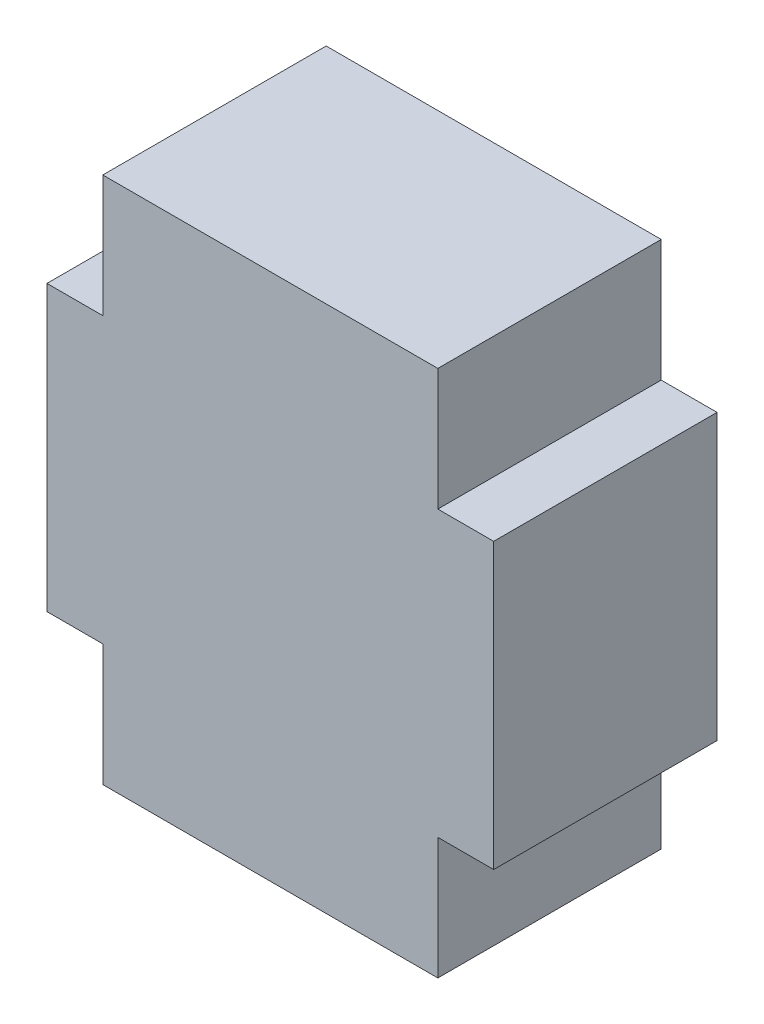
ISO-10303-21;
HEADER;
FILE_DESCRIPTION(('STEP AP214'),'2;1');
FILE_NAME('part.step','',(''),(''),'','','');
FILE_SCHEMA(('AUTOMOTIVE_DESIGN { 1 0 10303 214 1 1 1 1 }'));
ENDSEC;
DATA;
#1=APPLICATION_CONTEXT('core data for automotive mechanical design processes');
#2=APPLICATION_PROTOCOL_DEFINITION('international standard','automotive_design',2000,#1);
#3=PRODUCT_CONTEXT('',#1,'mechanical');
#4=PRODUCT('Part','Part','',(#3));
#5=PRODUCT_RELATED_PRODUCT_CATEGORY('part','',(#4));
#6=PRODUCT_DEFINITION_FORMATION('','',#4);
#7=PRODUCT_DEFINITION_CONTEXT('part definition',#1,'design');
#8=PRODUCT_DEFINITION('design','',#6,#7);
#9=PRODUCT_DEFINITION_SHAPE('','',#8);
#10=(LENGTH_UNIT() NAMED_UNIT(*) SI_UNIT(.MILLI.,.METRE.));
#11=(NAMED_UNIT(*) PLANE_ANGLE_UNIT() SI_UNIT($,.RADIAN.));
#12=(NAMED_UNIT(*) SI_UNIT($,.STERADIAN.) SOLID_ANGLE_UNIT());
#13=UNCERTAINTY_MEASURE_WITH_UNIT(LENGTH_MEASURE(1.E-05),#10,'distance_accuracy_value','');
#14=(GEOMETRIC_REPRESENTATION_CONTEXT(3) GLOBAL_UNCERTAINTY_ASSIGNED_CONTEXT((#13)) GLOBAL_UNIT_ASSIGNED_CONTEXT((#10,
#11,#12)) REPRESENTATION_CONTEXT('',''));
#15=CARTESIAN_POINT('',(0.,0.,0.));
#16=DIRECTION('',(0.,0.,1.));
#17=DIRECTION('',(1.,0.,0.));
#18=AXIS2_PLACEMENT_3D('',#15,#16,#17);
#19=CARTESIAN_POINT('',(0.825,-1.3,1.1));
#20=DIRECTION('',(0.,1.,0.));
#21=DIRECTION('',(0.,0.,1.));
#22=AXIS2_PLACEMENT_3D('',#19,#20,#21);
#23=PLANE('',#22);
#24=DIRECTION('',(1.,0.,0.));
#25=VECTOR('',#24,1.);
#26=CARTESIAN_POINT('',(0.825,-1.3,0.));
#27=LINE('',#26,#25);
#28=CARTESIAN_POINT('',(-0.825,-1.3,0.));
#29=VERTEX_POINT('',#28);
#30=CARTESIAN_POINT('',(0.825,-1.3,0.));
#31=VERTEX_POINT('',#30);
#32=EDGE_CURVE('E154',#29,#31,#27,.T.);
#33=ORIENTED_EDGE('',*,*,#32,.T.);
#34=DIRECTION('',(0.,0.,-1.));
#35=VECTOR('',#34,1.);
#36=CARTESIAN_POINT('',(0.825,-1.3,1.1));
#37=LINE('',#36,#35);
#38=CARTESIAN_POINT('',(0.825,-1.3,1.1));
#39=VERTEX_POINT('',#38);
#40=EDGE_CURVE('E11',#39,#31,#37,.T.);
#41=ORIENTED_EDGE('',*,*,#40,.F.);
#42=DIRECTION('',(1.,0.,0.));
#43=VECTOR('',#42,1.);
#44=CARTESIAN_POINT('',(0.825,-1.3,1.1));
#45=LINE('',#44,#43);
#46=CARTESIAN_POINT('',(-0.825,-1.3,1.1));
#47=VERTEX_POINT('',#46);
#48=EDGE_CURVE('E176',#47,#39,#45,.T.);
#49=ORIENTED_EDGE('',*,*,#48,.F.);
#50=DIRECTION('',(0.,0.,-1.));
#51=VECTOR('',#50,1.);
#52=CARTESIAN_POINT('',(-0.825,-1.3,1.1));
#53=LINE('',#52,#51);
#54=EDGE_CURVE('E150',#47,#29,#53,.T.);
#55=ORIENTED_EDGE('',*,*,#54,.T.);
#56=EDGE_LOOP('',(#33,#41,#49,#55));
#57=FACE_BOUND('',#56,.T.);
#58=ADVANCED_FACE('F34',(#57),#23,.F.);
#59=CARTESIAN_POINT('',(0.825,-0.7,1.1));
#60=DIRECTION('',(-1.,0.,0.));
#61=DIRECTION('',(0.,0.,1.));
#62=AXIS2_PLACEMENT_3D('',#59,#60,#61);
#63=PLANE('',#62);
#64=DIRECTION('',(0.,1.,0.));
#65=VECTOR('',#64,1.);
#66=CARTESIAN_POINT('',(0.825,-0.7,0.));
#67=LINE('',#66,#65);
#68=CARTESIAN_POINT('',(0.825,-0.7,0.));
#69=VERTEX_POINT('',#68);
#70=EDGE_CURVE('E157',#31,#69,#67,.T.);
#71=ORIENTED_EDGE('',*,*,#70,.T.);
#72=DIRECTION('',(0.,0.,-1.));
#73=VECTOR('',#72,1.);
#74=CARTESIAN_POINT('',(0.825,-0.7,1.1));
#75=LINE('',#74,#73);
#76=CARTESIAN_POINT('',(0.825,-0.7,1.1));
#77=VERTEX_POINT('',#76);
#78=EDGE_CURVE('E42',#77,#69,#75,.T.);
#79=ORIENTED_EDGE('',*,*,#78,.F.);
#80=DIRECTION('',(0.,1.,0.));
#81=VECTOR('',#80,1.);
#82=CARTESIAN_POINT('',(0.825,-0.7,1.1));
#83=LINE('',#82,#81);
#84=EDGE_CURVE('E105',#39,#77,#83,.T.);
#85=ORIENTED_EDGE('',*,*,#84,.F.);
#86=ORIENTED_EDGE('',*,*,#40,.T.);
#87=EDGE_LOOP('',(#71,#79,#85,#86));
#88=FACE_BOUND('',#87,.T.);
#89=ADVANCED_FACE('F254',(#88),#63,.F.);
#90=CARTESIAN_POINT('',(1.1,-0.7,1.1));
#91=DIRECTION('',(0.,1.,0.));
#92=DIRECTION('',(0.,0.,1.));
#93=AXIS2_PLACEMENT_3D('',#90,#91,#92);
#94=PLANE('',#93);
#95=DIRECTION('',(1.,0.,0.));
#96=VECTOR('',#95,1.);
#97=CARTESIAN_POINT('',(1.1,-0.7,0.));
#98=LINE('',#97,#96);
#99=CARTESIAN_POINT('',(1.1,-0.7,0.));
#100=VERTEX_POINT('',#99);
#101=EDGE_CURVE('E159',#69,#100,#98,.T.);
#102=ORIENTED_EDGE('',*,*,#101,.T.);
#103=DIRECTION('',(0.,0.,-1.));
#104=VECTOR('',#103,1.);
#105=CARTESIAN_POINT('',(1.1,-0.7,1.1));
#106=LINE('',#105,#104);
#107=CARTESIAN_POINT('',(1.1,-0.7,1.1));
#108=VERTEX_POINT('',#107);
#109=EDGE_CURVE('E195',#108,#100,#106,.T.);
#110=ORIENTED_EDGE('',*,*,#109,.F.);
#111=DIRECTION('',(1.,0.,0.));
#112=VECTOR('',#111,1.);
#113=CARTESIAN_POINT('',(1.1,-0.7,1.1));
#114=LINE('',#113,#112);
#115=EDGE_CURVE('E203',#77,#108,#114,.T.);
#116=ORIENTED_EDGE('',*,*,#115,.F.);
#117=ORIENTED_EDGE('',*,*,#78,.T.);
#118=EDGE_LOOP('',(#102,#110,#116,#117));
#119=FACE_BOUND('',#118,.T.);
#120=ADVANCED_FACE('F201',(#119),#94,.F.);
#121=CARTESIAN_POINT('',(1.1,0.7,1.1));
#122=DIRECTION('',(-1.,0.,0.));
#123=DIRECTION('',(0.,0.,1.));
#124=AXIS2_PLACEMENT_3D('',#121,#122,#123);
#125=PLANE('',#124);
#126=DIRECTION('',(0.,1.,0.));
#127=VECTOR('',#126,1.);
#128=CARTESIAN_POINT('',(1.1,0.7,0.));
#129=LINE('',#128,#127);
#130=CARTESIAN_POINT('',(1.1,0.7,0.));
#131=VERTEX_POINT('',#130);
#132=EDGE_CURVE('E161',#100,#131,#129,.T.);
#133=ORIENTED_EDGE('',*,*,#132,.T.);
#134=DIRECTION('',(0.,0.,-1.));
#135=VECTOR('',#134,1.);
#136=CARTESIAN_POINT('',(1.1,0.7,1.1));
#137=LINE('',#136,#135);
#138=CARTESIAN_POINT('',(1.1,0.7,1.1));
#139=VERTEX_POINT('',#138);
#140=EDGE_CURVE('E192',#139,#131,#137,.T.);
#141=ORIENTED_EDGE('',*,*,#140,.F.);
#142=DIRECTION('',(0.,1.,0.));
#143=VECTOR('',#142,1.);
#144=CARTESIAN_POINT('',(1.1,0.7,1.1));
#145=LINE('',#144,#143);
#146=EDGE_CURVE('E221',#108,#139,#145,.T.);
#147=ORIENTED_EDGE('',*,*,#146,.F.);
#148=ORIENTED_EDGE('',*,*,#109,.T.);
#149=EDGE_LOOP('',(#133,#141,#147,#148));
#150=FACE_BOUND('',#149,.T.);
#151=ADVANCED_FACE('F212',(#150),#125,.F.);
#152=CARTESIAN_POINT('',(0.825,0.7,1.1));
#153=DIRECTION('',(0.,-1.,0.));
#154=DIRECTION('',(0.,0.,-1.));
#155=AXIS2_PLACEMENT_3D('',#152,#153,#154);
#156=PLANE('',#155);
#157=DIRECTION('',(-1.,0.,0.));
#158=VECTOR('',#157,1.);
#159=CARTESIAN_POINT('',(0.825,0.7,0.));
#160=LINE('',#159,#158);
#161=CARTESIAN_POINT('',(0.825,0.7,0.));
#162=VERTEX_POINT('',#161);
#163=EDGE_CURVE('E163',#131,#162,#160,.T.);
#164=ORIENTED_EDGE('',*,*,#163,.T.);
#165=DIRECTION('',(0.,0.,-1.));
#166=VECTOR('',#165,1.);
#167=CARTESIAN_POINT('',(0.825,0.7,1.1));
#168=LINE('',#167,#166);
#169=CARTESIAN_POINT('',(0.825,0.7,1.1));
#170=VERTEX_POINT('',#169);
#171=EDGE_CURVE('E189',#170,#162,#168,.T.);
#172=ORIENTED_EDGE('',*,*,#171,.F.);
#173=DIRECTION('',(-1.,0.,0.));
#174=VECTOR('',#173,1.);
#175=CARTESIAN_POINT('',(0.825,0.7,1.1));
#176=LINE('',#175,#174);
#177=EDGE_CURVE('E218',#139,#170,#176,.T.);
#178=ORIENTED_EDGE('',*,*,#177,.F.);
#179=ORIENTED_EDGE('',*,*,#140,.T.);
#180=EDGE_LOOP('',(#164,#172,#178,#179));
#181=FACE_BOUND('',#180,.T.);
#182=ADVANCED_FACE('F216',(#181),#156,.F.);
#183=CARTESIAN_POINT('',(0.825,1.3,1.1));
#184=DIRECTION('',(-1.,0.,0.));
#185=DIRECTION('',(0.,0.,1.));
#186=AXIS2_PLACEMENT_3D('',#183,#184,#185);
#187=PLANE('',#186);
#188=DIRECTION('',(0.,1.,0.));
#189=VECTOR('',#188,1.);
#190=CARTESIAN_POINT('',(0.825,1.3,0.));
#191=LINE('',#190,#189);
#192=CARTESIAN_POINT('',(0.825,1.3,0.));
#193=VERTEX_POINT('',#192);
#194=EDGE_CURVE('E165',#162,#193,#191,.T.);
#195=ORIENTED_EDGE('',*,*,#194,.T.);
#196=DIRECTION('',(0.,0.,-1.));
#197=VECTOR('',#196,1.);
#198=CARTESIAN_POINT('',(0.825,1.3,1.1));
#199=LINE('',#198,#197);
#200=CARTESIAN_POINT('',(0.825,1.3,1.1));
#201=VERTEX_POINT('',#200);
#202=EDGE_CURVE('E186',#201,#193,#199,.T.);
#203=ORIENTED_EDGE('',*,*,#202,.F.);
#204=DIRECTION('',(0.,1.,0.));
#205=VECTOR('',#204,1.);
#206=CARTESIAN_POINT('',(0.825,1.3,1.1));
#207=LINE('',#206,#205);
#208=EDGE_CURVE('E220',#170,#201,#207,.T.);
#209=ORIENTED_EDGE('',*,*,#208,.F.);
#210=ORIENTED_EDGE('',*,*,#171,.T.);
#211=EDGE_LOOP('',(#195,#203,#209,#210));
#212=FACE_BOUND('',#211,.T.);
#213=ADVANCED_FACE('F267',(#212),#187,.F.);
#214=CARTESIAN_POINT('',(-0.825,1.3,1.1));
#215=DIRECTION('',(0.,-1.,0.));
#216=DIRECTION('',(0.,0.,-1.));
#217=AXIS2_PLACEMENT_3D('',#214,#215,#216);
#218=PLANE('',#217);
#219=DIRECTION('',(-1.,0.,0.));
#220=VECTOR('',#219,1.);
#221=CARTESIAN_POINT('',(-0.825,1.3,0.));
#222=LINE('',#221,#220);
#223=CARTESIAN_POINT('',(-0.825,1.3,0.));
#224=VERTEX_POINT('',#223);
#225=EDGE_CURVE('E167',#193,#224,#222,.T.);
#226=ORIENTED_EDGE('',*,*,#225,.T.);
#227=DIRECTION('',(0.,0.,-1.));
#228=VECTOR('',#227,1.);
#229=CARTESIAN_POINT('',(-0.825,1.3,1.1));
#230=LINE('',#229,#228);
#231=CARTESIAN_POINT('',(-0.825,1.3,1.1));
#232=VERTEX_POINT('',#231);
#233=EDGE_CURVE('E183',#232,#224,#230,.T.);
#234=ORIENTED_EDGE('',*,*,#233,.F.);
#235=DIRECTION('',(-1.,0.,0.));
#236=VECTOR('',#235,1.);
#237=CARTESIAN_POINT('',(-0.825,1.3,1.1));
#238=LINE('',#237,#236);
#239=EDGE_CURVE('E223',#201,#232,#238,.T.);
#240=ORIENTED_EDGE('',*,*,#239,.F.);
#241=ORIENTED_EDGE('',*,*,#202,.T.);
#242=EDGE_LOOP('',(#226,#234,#240,#241));
#243=FACE_BOUND('',#242,.T.);
#244=ADVANCED_FACE('F270',(#243),#218,.F.);
#245=CARTESIAN_POINT('',(-0.825,0.7,1.1));
#246=DIRECTION('',(1.,0.,0.));
#247=DIRECTION('',(0.,0.,-1.));
#248=AXIS2_PLACEMENT_3D('',#245,#246,#247);
#249=PLANE('',#248);
#250=DIRECTION('',(0.,-1.,0.));
#251=VECTOR('',#250,1.);
#252=CARTESIAN_POINT('',(-0.825,0.7,0.));
#253=LINE('',#252,#251);
#254=CARTESIAN_POINT('',(-0.825,0.7,0.));
#255=VERTEX_POINT('',#254);
#256=EDGE_CURVE('E169',#224,#255,#253,.T.);
#257=ORIENTED_EDGE('',*,*,#256,.T.);
#258=DIRECTION('',(0.,0.,-1.));
#259=VECTOR('',#258,1.);
#260=CARTESIAN_POINT('',(-0.825,0.7,1.1));
#261=LINE('',#260,#259);
#262=CARTESIAN_POINT('',(-0.825,0.7,1.1));
#263=VERTEX_POINT('',#262);
#264=EDGE_CURVE('E180',#263,#255,#261,.T.);
#265=ORIENTED_EDGE('',*,*,#264,.F.);
#266=DIRECTION('',(0.,-1.,0.));
#267=VECTOR('',#266,1.);
#268=CARTESIAN_POINT('',(-0.825,0.7,1.1));
#269=LINE('',#268,#267);
#270=EDGE_CURVE('E229',#232,#263,#269,.T.);
#271=ORIENTED_EDGE('',*,*,#270,.F.);
#272=ORIENTED_EDGE('',*,*,#233,.T.);
#273=EDGE_LOOP('',(#257,#265,#271,#272));
#274=FACE_BOUND('',#273,.T.);
#275=ADVANCED_FACE('F235',(#274),#249,.F.);
#276=CARTESIAN_POINT('',(-1.1,0.7,1.1));
#277=DIRECTION('',(0.,-1.,0.));
#278=DIRECTION('',(0.,0.,-1.));
#279=AXIS2_PLACEMENT_3D('',#276,#277,#278);
#280=PLANE('',#279);
#281=DIRECTION('',(-1.,0.,0.));
#282=VECTOR('',#281,1.);
#283=CARTESIAN_POINT('',(-1.1,0.7,0.));
#284=LINE('',#283,#282);
#285=CARTESIAN_POINT('',(-1.1,0.7,0.));
#286=VERTEX_POINT('',#285);
#287=EDGE_CURVE('E171',#255,#286,#284,.T.);
#288=ORIENTED_EDGE('',*,*,#287,.T.);
#289=DIRECTION('',(0.,0.,-1.));
#290=VECTOR('',#289,1.);
#291=CARTESIAN_POINT('',(-1.1,0.7,1.1));
#292=LINE('',#291,#290);
#293=CARTESIAN_POINT('',(-1.1,0.7,1.1));
#294=VERTEX_POINT('',#293);
#295=EDGE_CURVE('E145',#294,#286,#292,.T.);
#296=ORIENTED_EDGE('',*,*,#295,.F.);
#297=DIRECTION('',(-1.,0.,0.));
#298=VECTOR('',#297,1.);
#299=CARTESIAN_POINT('',(-1.1,0.7,1.1));
#300=LINE('',#299,#298);
#301=EDGE_CURVE('E136',#263,#294,#300,.T.);
#302=ORIENTED_EDGE('',*,*,#301,.F.);
#303=ORIENTED_EDGE('',*,*,#264,.T.);
#304=EDGE_LOOP('',(#288,#296,#302,#303));
#305=FACE_BOUND('',#304,.T.);
#306=ADVANCED_FACE('F239',(#305),#280,.F.);
#307=CARTESIAN_POINT('',(-1.1,-0.7,1.1));
#308=DIRECTION('',(1.,0.,0.));
#309=DIRECTION('',(0.,0.,-1.));
#310=AXIS2_PLACEMENT_3D('',#307,#308,#309);
#311=PLANE('',#310);
#312=DIRECTION('',(0.,-1.,0.));
#313=VECTOR('',#312,1.);
#314=CARTESIAN_POINT('',(-1.1,-0.7,0.));
#315=LINE('',#314,#313);
#316=CARTESIAN_POINT('',(-1.1,-0.7,0.));
#317=VERTEX_POINT('',#316);
#318=EDGE_CURVE('E144',#286,#317,#315,.T.);
#319=ORIENTED_EDGE('',*,*,#318,.T.);
#320=DIRECTION('',(0.,0.,-1.));
#321=VECTOR('',#320,1.);
#322=CARTESIAN_POINT('',(-1.1,-0.7,1.1));
#323=LINE('',#322,#321);
#324=CARTESIAN_POINT('',(-1.1,-0.7,1.1));
#325=VERTEX_POINT('',#324);
#326=EDGE_CURVE('E141',#325,#317,#323,.T.);
#327=ORIENTED_EDGE('',*,*,#326,.F.);
#328=DIRECTION('',(0.,-1.,0.));
#329=VECTOR('',#328,1.);
#330=CARTESIAN_POINT('',(-1.1,-0.7,1.1));
#331=LINE('',#330,#329);
#332=EDGE_CURVE('E130',#294,#325,#331,.T.);
#333=ORIENTED_EDGE('',*,*,#332,.F.);
#334=ORIENTED_EDGE('',*,*,#295,.T.);
#335=EDGE_LOOP('',(#319,#327,#333,#334));
#336=FACE_BOUND('',#335,.T.);
#337=ADVANCED_FACE('F142',(#336),#311,.F.);
#338=CARTESIAN_POINT('',(-0.825,-0.7,1.1));
#339=DIRECTION('',(0.,1.,0.));
#340=DIRECTION('',(0.,0.,1.));
#341=AXIS2_PLACEMENT_3D('',#338,#339,#340);
#342=PLANE('',#341);
#343=DIRECTION('',(1.,0.,0.));
#344=VECTOR('',#343,1.);
#345=CARTESIAN_POINT('',(-0.825,-0.7,0.));
#346=LINE('',#345,#344);
#347=CARTESIAN_POINT('',(-0.825,-0.7,0.));
#348=VERTEX_POINT('',#347);
#349=EDGE_CURVE('E91',#317,#348,#346,.T.);
#350=ORIENTED_EDGE('',*,*,#349,.T.);
#351=DIRECTION('',(0.,0.,-1.));
#352=VECTOR('',#351,1.);
#353=CARTESIAN_POINT('',(-0.825,-0.7,1.1));
#354=LINE('',#353,#352);
#355=CARTESIAN_POINT('',(-0.825,-0.7,1.1));
#356=VERTEX_POINT('',#355);
#357=EDGE_CURVE('E146',#356,#348,#354,.T.);
#358=ORIENTED_EDGE('',*,*,#357,.F.);
#359=DIRECTION('',(1.,0.,0.));
#360=VECTOR('',#359,1.);
#361=CARTESIAN_POINT('',(-0.825,-0.7,1.1));
#362=LINE('',#361,#360);
#363=EDGE_CURVE('E134',#325,#356,#362,.T.);
#364=ORIENTED_EDGE('',*,*,#363,.F.);
#365=ORIENTED_EDGE('',*,*,#326,.T.);
#366=EDGE_LOOP('',(#350,#358,#364,#365));
#367=FACE_BOUND('',#366,.T.);
#368=ADVANCED_FACE('F148',(#367),#342,.F.);
#369=CARTESIAN_POINT('',(-0.825,-1.3,1.1));
#370=DIRECTION('',(1.,0.,0.));
#371=DIRECTION('',(0.,0.,-1.));
#372=AXIS2_PLACEMENT_3D('',#369,#370,#371);
#373=PLANE('',#372);
#374=DIRECTION('',(0.,-1.,0.));
#375=VECTOR('',#374,1.);
#376=CARTESIAN_POINT('',(-0.825,-1.3,0.));
#377=LINE('',#376,#375);
#378=EDGE_CURVE('E97',#348,#29,#377,.T.);
#379=ORIENTED_EDGE('',*,*,#378,.T.);
#380=ORIENTED_EDGE('',*,*,#54,.F.);
#381=DIRECTION('',(0.,-1.,0.));
#382=VECTOR('',#381,1.);
#383=CARTESIAN_POINT('',(-0.825,-1.3,1.1));
#384=LINE('',#383,#382);
#385=EDGE_CURVE('E50',#356,#47,#384,.T.);
#386=ORIENTED_EDGE('',*,*,#385,.F.);
#387=ORIENTED_EDGE('',*,*,#357,.T.);
#388=EDGE_LOOP('',(#379,#380,#386,#387));
#389=FACE_BOUND('',#388,.T.);
#390=ADVANCED_FACE('F243',(#389),#373,.F.);
#391=CARTESIAN_POINT('',(0.,0.,1.1));
#392=DIRECTION('',(0.,0.,-1.));
#393=DIRECTION('',(-1.,0.,0.));
#394=AXIS2_PLACEMENT_3D('',#391,#392,#393);
#395=PLANE('',#394);
#396=ORIENTED_EDGE('',*,*,#48,.T.);
#397=ORIENTED_EDGE('',*,*,#84,.T.);
#398=ORIENTED_EDGE('',*,*,#115,.T.);
#399=ORIENTED_EDGE('',*,*,#146,.T.);
#400=ORIENTED_EDGE('',*,*,#177,.T.);
#401=ORIENTED_EDGE('',*,*,#208,.T.);
#402=ORIENTED_EDGE('',*,*,#239,.T.);
#403=ORIENTED_EDGE('',*,*,#270,.T.);
#404=ORIENTED_EDGE('',*,*,#301,.T.);
#405=ORIENTED_EDGE('',*,*,#332,.T.);
#406=ORIENTED_EDGE('',*,*,#363,.T.);
#407=ORIENTED_EDGE('',*,*,#385,.T.);
#408=EDGE_LOOP('',(#396,#397,#398,#399,#400,#401,#402,#403,#404,#405,#406,#407));
#409=FACE_BOUND('',#408,.T.);
#410=ADVANCED_FACE('F132',(#409),#395,.F.);
#411=CARTESIAN_POINT('',(0.,0.,0.));
#412=DIRECTION('',(0.,0.,-1.));
#413=DIRECTION('',(-1.,0.,0.));
#414=AXIS2_PLACEMENT_3D('',#411,#412,#413);
#415=PLANE('',#414);
#416=ORIENTED_EDGE('',*,*,#32,.F.);
#417=ORIENTED_EDGE('',*,*,#378,.F.);
#418=ORIENTED_EDGE('',*,*,#349,.F.);
#419=ORIENTED_EDGE('',*,*,#318,.F.);
#420=ORIENTED_EDGE('',*,*,#287,.F.);
#421=ORIENTED_EDGE('',*,*,#256,.F.);
#422=ORIENTED_EDGE('',*,*,#225,.F.);
#423=ORIENTED_EDGE('',*,*,#194,.F.);
#424=ORIENTED_EDGE('',*,*,#163,.F.);
#425=ORIENTED_EDGE('',*,*,#132,.F.);
#426=ORIENTED_EDGE('',*,*,#101,.F.);
#427=ORIENTED_EDGE('',*,*,#70,.F.);
#428=EDGE_LOOP('',(#416,#417,#418,#419,#420,#421,#422,#423,#424,#425,#426,#427));
#429=FACE_BOUND('',#428,.T.);
#430=ADVANCED_FACE('F207',(#429),#415,.T.);
#431=CLOSED_SHELL('',(#58,#89,#120,#151,#182,#213,#244,#275,#306,#337,#368,#390,#410,#430));
#432=MANIFOLD_SOLID_BREP('B2',#431);
#433=ADVANCED_BREP_SHAPE_REPRESENTATION('',(#18,#432),#14);
#434=SHAPE_DEFINITION_REPRESENTATION(#9,#433);
ENDSEC;
END-ISO-10303-21;
